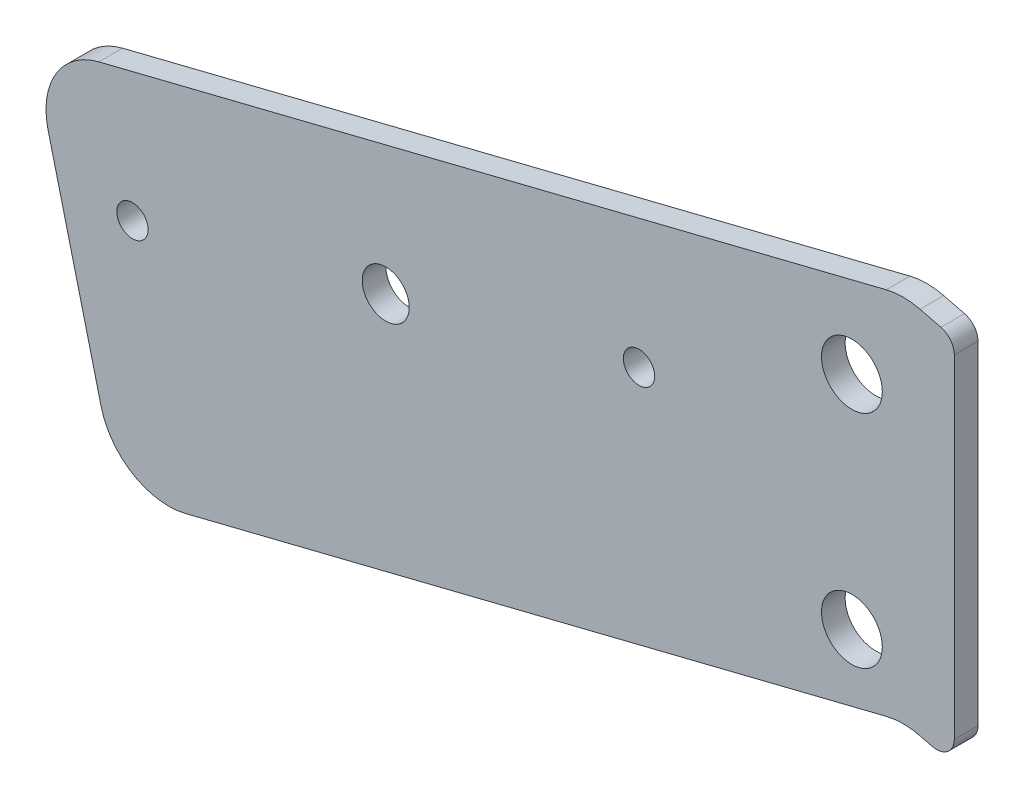
ISO-10303-21;
HEADER;
FILE_DESCRIPTION(('STEP AP214'),'2;1');
FILE_NAME('part.step','',(''),(''),'','','');
FILE_SCHEMA(('AUTOMOTIVE_DESIGN { 1 0 10303 214 1 1 1 1 }'));
ENDSEC;
DATA;
#1=APPLICATION_CONTEXT('core data for automotive mechanical design processes');
#2=APPLICATION_PROTOCOL_DEFINITION('international standard','automotive_design',2000,#1);
#3=PRODUCT_CONTEXT('',#1,'mechanical');
#4=PRODUCT('Part','Part','',(#3));
#5=PRODUCT_RELATED_PRODUCT_CATEGORY('part','',(#4));
#6=PRODUCT_DEFINITION_FORMATION('','',#4);
#7=PRODUCT_DEFINITION_CONTEXT('part definition',#1,'design');
#8=PRODUCT_DEFINITION('design','',#6,#7);
#9=PRODUCT_DEFINITION_SHAPE('','',#8);
#10=(LENGTH_UNIT() NAMED_UNIT(*) SI_UNIT(.MILLI.,.METRE.));
#11=(NAMED_UNIT(*) PLANE_ANGLE_UNIT() SI_UNIT($,.RADIAN.));
#12=(NAMED_UNIT(*) SI_UNIT($,.STERADIAN.) SOLID_ANGLE_UNIT());
#13=UNCERTAINTY_MEASURE_WITH_UNIT(LENGTH_MEASURE(1.E-05),#10,'distance_accuracy_value','');
#14=(GEOMETRIC_REPRESENTATION_CONTEXT(3) GLOBAL_UNCERTAINTY_ASSIGNED_CONTEXT((#13)) GLOBAL_UNIT_ASSIGNED_CONTEXT((#10,
#11,#12)) REPRESENTATION_CONTEXT('',''));
#15=CARTESIAN_POINT('',(0.,0.,0.));
#16=DIRECTION('',(0.,0.,1.));
#17=DIRECTION('',(1.,0.,0.));
#18=AXIS2_PLACEMENT_3D('',#15,#16,#17);
#19=CARTESIAN_POINT('',(4.80832124547875,-67.8898570883943,-3.4036));
#20=DIRECTION('',(0.,0.,1.));
#21=DIRECTION('',(1.,0.,0.));
#22=AXIS2_PLACEMENT_3D('',#19,#20,#21);
#23=CYLINDRICAL_SURFACE('',#22,2.54);
#24=CARTESIAN_POINT('',(4.80832124547875,-67.8898570883943,0.));
#25=DIRECTION('',(0.,0.,1.));
#26=DIRECTION('',(1.,0.,0.));
#27=AXIS2_PLACEMENT_3D('',#24,#25,#26);
#28=CIRCLE('',#27,2.54);
#29=CARTESIAN_POINT('',(4.19383963065623,-70.3544082331355,0.));
#30=VERTEX_POINT('',#29);
#31=CARTESIAN_POINT('',(7.34832124547875,-67.8898570883943,0.));
#32=VERTEX_POINT('',#31);
#33=EDGE_CURVE('E159',#30,#32,#28,.T.);
#34=ORIENTED_EDGE('',*,*,#33,.F.);
#35=DIRECTION('',(0.,0.,1.));
#36=VECTOR('',#35,1.);
#37=CARTESIAN_POINT('',(4.19383963065623,-70.3544082331355,-3.4036));
#38=LINE('',#37,#36);
#39=CARTESIAN_POINT('',(4.19383963065623,-70.3544082331355,-3.4036));
#40=VERTEX_POINT('',#39);
#41=EDGE_CURVE('E11',#40,#30,#38,.T.);
#42=ORIENTED_EDGE('',*,*,#41,.F.);
#43=CARTESIAN_POINT('',(4.80832124547875,-67.8898570883943,-3.4036));
#44=DIRECTION('',(0.,0.,1.));
#45=DIRECTION('',(1.,0.,0.));
#46=AXIS2_PLACEMENT_3D('',#43,#44,#45);
#47=CIRCLE('',#46,2.54);
#48=CARTESIAN_POINT('',(7.34832124547875,-67.8898570883943,-3.4036));
#49=VERTEX_POINT('',#48);
#50=EDGE_CURVE('E192',#40,#49,#47,.T.);
#51=ORIENTED_EDGE('',*,*,#50,.T.);
#52=DIRECTION('',(0.,0.,1.));
#53=VECTOR('',#52,1.);
#54=CARTESIAN_POINT('',(7.34832124547875,-67.8898570883943,-3.4036));
#55=LINE('',#54,#53);
#56=EDGE_CURVE('E41',#49,#32,#55,.T.);
#57=ORIENTED_EDGE('',*,*,#56,.T.);
#58=EDGE_LOOP('',(#34,#42,#51,#57));
#59=FACE_BOUND('',#58,.T.);
#60=ADVANCED_FACE('F38',(#59),#23,.T.);
#61=CARTESIAN_POINT('',(4.19383963065623,-70.3544082331355,-3.4036));
#62=DIRECTION('',(-0.241921895599874,-0.970295726275945,0.));
#63=DIRECTION('',(0.970295726275945,-0.241921895599874,0.));
#64=AXIS2_PLACEMENT_3D('',#61,#62,#63);
#65=PLANE('',#64);
#66=DIRECTION('',(0.970295726275945,-0.241921895599874,0.));
#67=VECTOR('',#66,1.);
#68=CARTESIAN_POINT('',(4.19383963065623,-70.3544082331355,0.));
#69=LINE('',#68,#67);
#70=CARTESIAN_POINT('',(2.41921895599391,-69.9119456045174,0.));
#71=VERTEX_POINT('',#70);
#72=EDGE_CURVE('E190',#71,#30,#69,.T.);
#73=ORIENTED_EDGE('',*,*,#72,.F.);
#74=DIRECTION('',(0.,0.,1.));
#75=VECTOR('',#74,1.);
#76=CARTESIAN_POINT('',(2.41921895599391,-69.9119456045174,-3.4036));
#77=LINE('',#76,#75);
#78=CARTESIAN_POINT('',(2.41921895599391,-69.9119456045174,-3.4036));
#79=VERTEX_POINT('',#78);
#80=EDGE_CURVE('E47',#79,#71,#77,.T.);
#81=ORIENTED_EDGE('',*,*,#80,.F.);
#82=DIRECTION('',(0.970295726275945,-0.241921895599874,0.));
#83=VECTOR('',#82,1.);
#84=CARTESIAN_POINT('',(4.19383963065623,-70.3544082331355,-3.4036));
#85=LINE('',#84,#83);
#86=EDGE_CURVE('E149',#79,#40,#85,.T.);
#87=ORIENTED_EDGE('',*,*,#86,.T.);
#88=ORIENTED_EDGE('',*,*,#41,.T.);
#89=EDGE_LOOP('',(#73,#81,#87,#88));
#90=FACE_BOUND('',#89,.T.);
#91=ADVANCED_FACE('F212',(#90),#65,.T.);
#92=CARTESIAN_POINT('',(3.00020425170189E-12,-79.6149028672788,-3.4036));
#93=DIRECTION('',(0.,0.,1.));
#94=DIRECTION('',(1.,0.,0.));
#95=AXIS2_PLACEMENT_3D('',#92,#93,#94);
#96=CYLINDRICAL_SURFACE('',#95,10.);
#97=CARTESIAN_POINT('',(3.00020425170189E-12,-79.6149028672788,0.));
#98=DIRECTION('',(0.,0.,-1.));
#99=DIRECTION('',(1.,0.,0.));
#100=AXIS2_PLACEMENT_3D('',#97,#98,#99);
#101=CIRCLE('',#100,10.);
#102=CARTESIAN_POINT('',(-2.41921895599365,-69.9119456045188,0.));
#103=VERTEX_POINT('',#102);
#104=EDGE_CURVE('E136',#103,#71,#101,.T.);
#105=ORIENTED_EDGE('',*,*,#104,.F.);
#106=DIRECTION('',(0.,0.,1.));
#107=VECTOR('',#106,1.);
#108=CARTESIAN_POINT('',(-2.41921895599365,-69.9119456045188,-3.4036));
#109=LINE('',#108,#107);
#110=CARTESIAN_POINT('',(-2.41921895599365,-69.9119456045188,-3.4036));
#111=VERTEX_POINT('',#110);
#112=EDGE_CURVE('E131',#111,#103,#109,.T.);
#113=ORIENTED_EDGE('',*,*,#112,.F.);
#114=CARTESIAN_POINT('',(3.00020425170189E-12,-79.6149028672788,-3.4036));
#115=DIRECTION('',(0.,0.,-1.));
#116=DIRECTION('',(1.,0.,0.));
#117=AXIS2_PLACEMENT_3D('',#114,#115,#116);
#118=CIRCLE('',#117,10.);
#119=EDGE_CURVE('E134',#111,#79,#118,.T.);
#120=ORIENTED_EDGE('',*,*,#119,.T.);
#121=ORIENTED_EDGE('',*,*,#80,.T.);
#122=EDGE_LOOP('',(#105,#113,#120,#121));
#123=FACE_BOUND('',#122,.T.);
#124=ADVANCED_FACE('F133',(#123),#96,.F.);
#125=CARTESIAN_POINT('',(-2.41921895599365,-69.9119456045188,-3.4036));
#126=DIRECTION('',(0.241921895599666,-0.970295726275997,0.));
#127=DIRECTION('',(0.970295726275997,0.241921895599666,0.));
#128=AXIS2_PLACEMENT_3D('',#125,#126,#127);
#129=PLANE('',#128);
#130=DIRECTION('',(0.970295726275997,0.241921895599666,0.));
#131=VECTOR('',#130,1.);
#132=CARTESIAN_POINT('',(-2.41921895599365,-69.9119456045188,0.));
#133=LINE('',#132,#131);
#134=CARTESIAN_POINT('',(-103.10199011941,-95.0149798594103,0.));
#135=VERTEX_POINT('',#134);
#136=EDGE_CURVE('E187',#135,#103,#133,.T.);
#137=ORIENTED_EDGE('',*,*,#136,.F.);
#138=DIRECTION('',(0.,0.,1.));
#139=VECTOR('',#138,1.);
#140=CARTESIAN_POINT('',(-103.10199011941,-95.0149798594103,-3.4036));
#141=LINE('',#140,#139);
#142=CARTESIAN_POINT('',(-103.10199011941,-95.0149798594103,-3.4036));
#143=VERTEX_POINT('',#142);
#144=EDGE_CURVE('E141',#143,#135,#141,.T.);
#145=ORIENTED_EDGE('',*,*,#144,.F.);
#146=DIRECTION('',(0.970295726275997,0.241921895599666,0.));
#147=VECTOR('',#146,1.);
#148=CARTESIAN_POINT('',(-2.41921895599365,-69.9119456045188,-3.4036));
#149=LINE('',#148,#147);
#150=EDGE_CURVE('E147',#143,#111,#149,.T.);
#151=ORIENTED_EDGE('',*,*,#150,.T.);
#152=ORIENTED_EDGE('',*,*,#112,.T.);
#153=EDGE_LOOP('',(#137,#145,#151,#152));
#154=FACE_BOUND('',#153,.T.);
#155=ADVANCED_FACE('F151',(#154),#129,.T.);
#156=CARTESIAN_POINT('',(-105.521209075407,-85.3120225966503,-3.4036));
#157=DIRECTION('',(0.,0.,1.));
#158=DIRECTION('',(1.,0.,0.));
#159=AXIS2_PLACEMENT_3D('',#156,#157,#158);
#160=CYLINDRICAL_SURFACE('',#159,9.99999999999999);
#161=CARTESIAN_POINT('',(-105.521209075407,-85.3120225966503,0.));
#162=DIRECTION('',(0.,0.,1.));
#163=DIRECTION('',(-1.,0.,0.));
#164=AXIS2_PLACEMENT_3D('',#161,#162,#163);
#165=CIRCLE('',#164,9.99999999999999);
#166=CARTESIAN_POINT('',(-115.224166338167,-87.7312415526469,0.));
#167=VERTEX_POINT('',#166);
#168=EDGE_CURVE('E184',#167,#135,#165,.T.);
#169=ORIENTED_EDGE('',*,*,#168,.F.);
#170=DIRECTION('',(0.,0.,1.));
#171=VECTOR('',#170,1.);
#172=CARTESIAN_POINT('',(-115.224166338167,-87.7312415526469,-3.4036));
#173=LINE('',#172,#171);
#174=CARTESIAN_POINT('',(-115.224166338167,-87.7312415526469,-3.4036));
#175=VERTEX_POINT('',#174);
#176=EDGE_CURVE('E196',#175,#167,#173,.T.);
#177=ORIENTED_EDGE('',*,*,#176,.F.);
#178=CARTESIAN_POINT('',(-105.521209075407,-85.3120225966503,-3.4036));
#179=DIRECTION('',(0.,0.,1.));
#180=DIRECTION('',(-1.,0.,0.));
#181=AXIS2_PLACEMENT_3D('',#178,#179,#180);
#182=CIRCLE('',#181,9.99999999999999);
#183=EDGE_CURVE('E152',#175,#143,#182,.T.);
#184=ORIENTED_EDGE('',*,*,#183,.T.);
#185=ORIENTED_EDGE('',*,*,#144,.T.);
#186=EDGE_LOOP('',(#169,#177,#184,#185));
#187=FACE_BOUND('',#186,.T.);
#188=ADVANCED_FACE('F225',(#187),#160,.T.);
#189=CARTESIAN_POINT('',(-115.224166338167,-87.7312415526469,-3.4036));
#190=DIRECTION('',(-0.970295726275997,-0.241921895599665,0.));
#191=DIRECTION('',(0.241921895599665,-0.970295726275997,0.));
#192=AXIS2_PLACEMENT_3D('',#189,#190,#191);
#193=PLANE('',#192);
#194=DIRECTION('',(0.241921895599665,-0.970295726275997,0.));
#195=VECTOR('',#194,1.);
#196=CARTESIAN_POINT('',(-115.224166338167,-87.7312415526469,0.));
#197=LINE('',#196,#195);
#198=CARTESIAN_POINT('',(-122.844706049556,-57.166926174953,0.));
#199=VERTEX_POINT('',#198);
#200=EDGE_CURVE('E181',#199,#167,#197,.T.);
#201=ORIENTED_EDGE('',*,*,#200,.F.);
#202=DIRECTION('',(0.,0.,1.));
#203=VECTOR('',#202,1.);
#204=CARTESIAN_POINT('',(-122.844706049556,-57.166926174953,-3.4036));
#205=LINE('',#204,#203);
#206=CARTESIAN_POINT('',(-122.844706049556,-57.166926174953,-3.4036));
#207=VERTEX_POINT('',#206);
#208=EDGE_CURVE('E198',#207,#199,#205,.T.);
#209=ORIENTED_EDGE('',*,*,#208,.F.);
#210=DIRECTION('',(0.241921895599665,-0.970295726275997,0.));
#211=VECTOR('',#210,1.);
#212=CARTESIAN_POINT('',(-115.224166338167,-87.7312415526469,-3.4036));
#213=LINE('',#212,#211);
#214=EDGE_CURVE('E154',#207,#175,#213,.T.);
#215=ORIENTED_EDGE('',*,*,#214,.T.);
#216=ORIENTED_EDGE('',*,*,#176,.T.);
#217=EDGE_LOOP('',(#201,#209,#215,#216));
#218=FACE_BOUND('',#217,.T.);
#219=ADVANCED_FACE('F228',(#218),#193,.T.);
#220=CARTESIAN_POINT('',(-113.141748786797,-54.7477072189564,-3.4036));
#221=DIRECTION('',(0.,0.,1.));
#222=DIRECTION('',(1.,0.,0.));
#223=AXIS2_PLACEMENT_3D('',#220,#221,#222);
#224=CYLINDRICAL_SURFACE('',#223,10.);
#225=CARTESIAN_POINT('',(-113.141748786797,-54.7477072189564,0.));
#226=DIRECTION('',(0.,0.,1.));
#227=DIRECTION('',(1.,0.,0.));
#228=AXIS2_PLACEMENT_3D('',#225,#226,#227);
#229=CIRCLE('',#228,10.);
#230=CARTESIAN_POINT('',(-115.560967742793,-45.0447499561964,0.));
#231=VERTEX_POINT('',#230);
#232=EDGE_CURVE('E178',#231,#199,#229,.T.);
#233=ORIENTED_EDGE('',*,*,#232,.F.);
#234=DIRECTION('',(0.,0.,1.));
#235=VECTOR('',#234,1.);
#236=CARTESIAN_POINT('',(-115.560967742793,-45.0447499561964,-3.4036));
#237=LINE('',#236,#235);
#238=CARTESIAN_POINT('',(-115.560967742793,-45.0447499561964,-3.4036));
#239=VERTEX_POINT('',#238);
#240=EDGE_CURVE('E200',#239,#231,#237,.T.);
#241=ORIENTED_EDGE('',*,*,#240,.F.);
#242=CARTESIAN_POINT('',(-113.141748786797,-54.7477072189564,-3.4036));
#243=DIRECTION('',(0.,0.,1.));
#244=DIRECTION('',(1.,0.,0.));
#245=AXIS2_PLACEMENT_3D('',#242,#243,#244);
#246=CIRCLE('',#245,10.);
#247=EDGE_CURVE('E332',#239,#207,#246,.T.);
#248=ORIENTED_EDGE('',*,*,#247,.T.);
#249=ORIENTED_EDGE('',*,*,#208,.T.);
#250=EDGE_LOOP('',(#233,#241,#248,#249));
#251=FACE_BOUND('',#250,.T.);
#252=ADVANCED_FACE('F232',(#251),#224,.T.);
#253=CARTESIAN_POINT('',(-115.560967742793,-45.0447499561964,-3.4036));
#254=DIRECTION('',(-0.241921895599665,0.970295726275997,0.));
#255=DIRECTION('',(-0.970295726275997,-0.241921895599665,0.));
#256=AXIS2_PLACEMENT_3D('',#253,#254,#255);
#257=PLANE('',#256);
#258=DIRECTION('',(-0.970295726275997,-0.241921895599665,0.));
#259=VECTOR('',#258,1.);
#260=CARTESIAN_POINT('',(-115.560967742793,-45.0447499561964,0.));
#261=LINE('',#260,#259);
#262=CARTESIAN_POINT('',(-2.41921895599665,-16.8353436929998,0.));
#263=VERTEX_POINT('',#262);
#264=EDGE_CURVE('E175',#263,#231,#261,.T.);
#265=ORIENTED_EDGE('',*,*,#264,.F.);
#266=DIRECTION('',(0.,0.,1.));
#267=VECTOR('',#266,1.);
#268=CARTESIAN_POINT('',(-2.41921895599665,-16.8353436929998,-3.4036));
#269=LINE('',#268,#267);
#270=CARTESIAN_POINT('',(-2.41921895599665,-16.8353436929998,-3.4036));
#271=VERTEX_POINT('',#270);
#272=EDGE_CURVE('E202',#271,#263,#269,.T.);
#273=ORIENTED_EDGE('',*,*,#272,.F.);
#274=DIRECTION('',(-0.970295726275997,-0.241921895599665,0.));
#275=VECTOR('',#274,1.);
#276=CARTESIAN_POINT('',(-115.560967742793,-45.0447499561964,-3.4036));
#277=LINE('',#276,#275);
#278=EDGE_CURVE('E329',#271,#239,#277,.T.);
#279=ORIENTED_EDGE('',*,*,#278,.T.);
#280=ORIENTED_EDGE('',*,*,#240,.T.);
#281=EDGE_LOOP('',(#265,#273,#279,#280));
#282=FACE_BOUND('',#281,.T.);
#283=ADVANCED_FACE('F236',(#282),#257,.T.);
#284=CARTESIAN_POINT('',(0.,-26.5383009557598,-3.4036));
#285=DIRECTION('',(0.,0.,1.));
#286=DIRECTION('',(1.,0.,0.));
#287=AXIS2_PLACEMENT_3D('',#284,#285,#286);
#288=CYLINDRICAL_SURFACE('',#287,10.);
#289=CARTESIAN_POINT('',(0.,-26.5383009557598,0.));
#290=DIRECTION('',(0.,0.,1.));
#291=DIRECTION('',(-1.,0.,0.));
#292=AXIS2_PLACEMENT_3D('',#289,#290,#291);
#293=CIRCLE('',#292,10.);
#294=CARTESIAN_POINT('',(2.41921895599665,-16.8353436929998,0.));
#295=VERTEX_POINT('',#294);
#296=EDGE_CURVE('E172',#295,#263,#293,.T.);
#297=ORIENTED_EDGE('',*,*,#296,.F.);
#298=DIRECTION('',(0.,0.,1.));
#299=VECTOR('',#298,1.);
#300=CARTESIAN_POINT('',(2.41921895599665,-16.8353436929998,-3.4036));
#301=LINE('',#300,#299);
#302=CARTESIAN_POINT('',(2.41921895599665,-16.8353436929998,-3.4036));
#303=VERTEX_POINT('',#302);
#304=EDGE_CURVE('E204',#303,#295,#301,.T.);
#305=ORIENTED_EDGE('',*,*,#304,.F.);
#306=CARTESIAN_POINT('',(0.,-26.5383009557598,-3.4036));
#307=DIRECTION('',(0.,0.,1.));
#308=DIRECTION('',(-1.,0.,0.));
#309=AXIS2_PLACEMENT_3D('',#306,#307,#308);
#310=CIRCLE('',#309,10.);
#311=EDGE_CURVE('E326',#303,#271,#310,.T.);
#312=ORIENTED_EDGE('',*,*,#311,.T.);
#313=ORIENTED_EDGE('',*,*,#272,.T.);
#314=EDGE_LOOP('',(#297,#305,#312,#313));
#315=FACE_BOUND('',#314,.T.);
#316=ADVANCED_FACE('F240',(#315),#288,.T.);
#317=CARTESIAN_POINT('',(2.41921895599665,-16.8353436929998,-3.4036));
#318=DIRECTION('',(0.241921895599675,0.970295726275995,0.));
#319=DIRECTION('',(-0.970295726275995,0.241921895599675,0.));
#320=AXIS2_PLACEMENT_3D('',#317,#318,#319);
#321=PLANE('',#320);
#322=DIRECTION('',(-0.970295726275995,0.241921895599675,0.));
#323=VECTOR('',#322,1.);
#324=CARTESIAN_POINT('',(2.41921895599665,-16.8353436929998,0.));
#325=LINE('',#324,#323);
#326=CARTESIAN_POINT('',(5.42280286030191,-17.5842212692322,0.));
#327=VERTEX_POINT('',#326);
#328=EDGE_CURVE('E169',#327,#295,#325,.T.);
#329=ORIENTED_EDGE('',*,*,#328,.F.);
#330=DIRECTION('',(0.,0.,1.));
#331=VECTOR('',#330,1.);
#332=CARTESIAN_POINT('',(5.42280286030191,-17.5842212692322,-3.4036));
#333=LINE('',#332,#331);
#334=CARTESIAN_POINT('',(5.42280286030191,-17.5842212692322,-3.4036));
#335=VERTEX_POINT('',#334);
#336=EDGE_CURVE('E206',#335,#327,#333,.T.);
#337=ORIENTED_EDGE('',*,*,#336,.F.);
#338=DIRECTION('',(-0.970295726275995,0.241921895599675,0.));
#339=VECTOR('',#338,1.);
#340=CARTESIAN_POINT('',(2.41921895599665,-16.8353436929998,-3.4036));
#341=LINE('',#340,#339);
#342=EDGE_CURVE('E323',#335,#303,#341,.T.);
#343=ORIENTED_EDGE('',*,*,#342,.T.);
#344=ORIENTED_EDGE('',*,*,#304,.T.);
#345=EDGE_LOOP('',(#329,#337,#343,#344));
#346=FACE_BOUND('',#345,.T.);
#347=ADVANCED_FACE('F244',(#346),#321,.T.);
#348=CARTESIAN_POINT('',(4.80832124547874,-20.0487724139733,-3.4036));
#349=DIRECTION('',(0.,0.,1.));
#350=DIRECTION('',(1.,0.,0.));
#351=AXIS2_PLACEMENT_3D('',#348,#349,#350);
#352=CYLINDRICAL_SURFACE('',#351,2.54);
#353=CARTESIAN_POINT('',(4.80832124547874,-20.0487724139733,0.));
#354=DIRECTION('',(0.,0.,1.));
#355=DIRECTION('',(-1.,0.,0.));
#356=AXIS2_PLACEMENT_3D('',#353,#354,#355);
#357=CIRCLE('',#356,2.54);
#358=CARTESIAN_POINT('',(7.34832124547874,-20.0487724139733,0.));
#359=VERTEX_POINT('',#358);
#360=EDGE_CURVE('E166',#359,#327,#357,.T.);
#361=ORIENTED_EDGE('',*,*,#360,.F.);
#362=DIRECTION('',(0.,0.,1.));
#363=VECTOR('',#362,1.);
#364=CARTESIAN_POINT('',(7.34832124547874,-20.0487724139733,-3.4036));
#365=LINE('',#364,#363);
#366=CARTESIAN_POINT('',(7.34832124547874,-20.0487724139733,-3.4036));
#367=VERTEX_POINT('',#366);
#368=EDGE_CURVE('E207',#367,#359,#365,.T.);
#369=ORIENTED_EDGE('',*,*,#368,.F.);
#370=CARTESIAN_POINT('',(4.80832124547874,-20.0487724139733,-3.4036));
#371=DIRECTION('',(0.,0.,1.));
#372=DIRECTION('',(-1.,0.,0.));
#373=AXIS2_PLACEMENT_3D('',#370,#371,#372);
#374=CIRCLE('',#373,2.54);
#375=EDGE_CURVE('E320',#367,#335,#374,.T.);
#376=ORIENTED_EDGE('',*,*,#375,.T.);
#377=ORIENTED_EDGE('',*,*,#336,.T.);
#378=EDGE_LOOP('',(#361,#369,#376,#377));
#379=FACE_BOUND('',#378,.T.);
#380=ADVANCED_FACE('F248',(#379),#352,.T.);
#381=CARTESIAN_POINT('',(7.34832124547874,-20.0487724139733,-3.4036));
#382=DIRECTION('',(1.,0.,0.));
#383=DIRECTION('',(0.,1.,0.));
#384=AXIS2_PLACEMENT_3D('',#381,#382,#383);
#385=PLANE('',#384);
#386=DIRECTION('',(0.,1.,0.));
#387=VECTOR('',#386,1.);
#388=CARTESIAN_POINT('',(7.34832124547874,-20.0487724139733,0.));
#389=LINE('',#388,#387);
#390=EDGE_CURVE('E162',#32,#359,#389,.T.);
#391=ORIENTED_EDGE('',*,*,#390,.F.);
#392=ORIENTED_EDGE('',*,*,#56,.F.);
#393=DIRECTION('',(0.,1.,0.));
#394=VECTOR('',#393,1.);
#395=CARTESIAN_POINT('',(7.34832124547874,-20.0487724139733,-3.4036));
#396=LINE('',#395,#394);
#397=EDGE_CURVE('E318',#49,#367,#396,.T.);
#398=ORIENTED_EDGE('',*,*,#397,.T.);
#399=ORIENTED_EDGE('',*,*,#368,.T.);
#400=EDGE_LOOP('',(#391,#392,#398,#399));
#401=FACE_BOUND('',#400,.T.);
#402=ADVANCED_FACE('F209',(#401),#385,.T.);
#403=CARTESIAN_POINT('',(4.80832124547875,-67.8898570883943,-3.4036));
#404=DIRECTION('',(0.,0.,1.));
#405=DIRECTION('',(1.,0.,0.));
#406=AXIS2_PLACEMENT_3D('',#403,#404,#405);
#407=PLANE('',#406);
#408=CARTESIAN_POINT('',(-7.36599999999999,-61.5695602345621,-3.4036));
#409=DIRECTION('',(0.,0.,1.));
#410=DIRECTION('',(1.,0.,0.));
#411=AXIS2_PLACEMENT_3D('',#408,#409,#410);
#412=CIRCLE('',#411,4.3688);
#413=CARTESIAN_POINT('',(-2.99719999999999,-61.5695602345621,-3.4036));
#414=VERTEX_POINT('',#413);
#415=EDGE_CURVE('E287',#414,#414,#412,.T.);
#416=ORIENTED_EDGE('',*,*,#415,.T.);
#417=EDGE_LOOP('',(#416));
#418=FACE_BOUND('',#417,.T.);
#419=CARTESIAN_POINT('',(-7.366,-29.8195602345622,-3.4036));
#420=DIRECTION('',(0.,0.,1.));
#421=DIRECTION('',(1.,0.,0.));
#422=AXIS2_PLACEMENT_3D('',#419,#420,#421);
#423=CIRCLE('',#422,4.3688);
#424=CARTESIAN_POINT('',(-2.9972,-29.8195602345622,-3.4036));
#425=VERTEX_POINT('',#424);
#426=EDGE_CURVE('E297',#425,#425,#423,.T.);
#427=ORIENTED_EDGE('',*,*,#426,.T.);
#428=EDGE_LOOP('',(#427));
#429=FACE_BOUND('',#428,.T.);
#430=CARTESIAN_POINT('',(-110.721225758861,-62.3891120813645,-3.4036));
#431=DIRECTION('',(0.,0.,1.));
#432=DIRECTION('',(1.,0.,0.));
#433=AXIS2_PLACEMENT_3D('',#430,#431,#432);
#434=CIRCLE('',#433,2.25);
#435=CARTESIAN_POINT('',(-108.471225758861,-62.3891120813645,-3.4036));
#436=VERTEX_POINT('',#435);
#437=EDGE_CURVE('E303',#436,#436,#434,.T.);
#438=ORIENTED_EDGE('',*,*,#437,.T.);
#439=EDGE_LOOP('',(#438));
#440=FACE_BOUND('',#439,.T.);
#441=CARTESIAN_POINT('',(-37.9490462881614,-44.2449699113896,-3.4036));
#442=DIRECTION('',(0.,0.,1.));
#443=DIRECTION('',(1.,0.,0.));
#444=AXIS2_PLACEMENT_3D('',#441,#442,#443);
#445=CIRCLE('',#444,2.25);
#446=CARTESIAN_POINT('',(-35.6990462881614,-44.2449699113896,-3.4036));
#447=VERTEX_POINT('',#446);
#448=EDGE_CURVE('E309',#447,#447,#445,.T.);
#449=ORIENTED_EDGE('',*,*,#448,.T.);
#450=EDGE_LOOP('',(#449));
#451=FACE_BOUND('',#450,.T.);
#452=CARTESIAN_POINT('',(-74.3351360235113,-53.317040996377,-3.4036));
#453=DIRECTION('',(0.,0.,1.));
#454=DIRECTION('',(1.,0.,0.));
#455=AXIS2_PLACEMENT_3D('',#452,#453,#454);
#456=CIRCLE('',#455,3.3782);
#457=CARTESIAN_POINT('',(-70.9569360235113,-53.317040996377,-3.4036));
#458=VERTEX_POINT('',#457);
#459=EDGE_CURVE('E163',#458,#458,#456,.T.);
#460=ORIENTED_EDGE('',*,*,#459,.T.);
#461=EDGE_LOOP('',(#460));
#462=FACE_BOUND('',#461,.T.);
#463=ORIENTED_EDGE('',*,*,#50,.F.);
#464=ORIENTED_EDGE('',*,*,#86,.F.);
#465=ORIENTED_EDGE('',*,*,#119,.F.);
#466=ORIENTED_EDGE('',*,*,#150,.F.);
#467=ORIENTED_EDGE('',*,*,#183,.F.);
#468=ORIENTED_EDGE('',*,*,#214,.F.);
#469=ORIENTED_EDGE('',*,*,#247,.F.);
#470=ORIENTED_EDGE('',*,*,#278,.F.);
#471=ORIENTED_EDGE('',*,*,#311,.F.);
#472=ORIENTED_EDGE('',*,*,#342,.F.);
#473=ORIENTED_EDGE('',*,*,#375,.F.);
#474=ORIENTED_EDGE('',*,*,#397,.F.);
#475=EDGE_LOOP('',(#463,#464,#465,#466,#467,#468,#469,#470,#471,#472,#473,#474));
#476=FACE_BOUND('',#475,.T.);
#477=ADVANCED_FACE('F145',(#418,#429,#440,#451,#462,#476),#407,.F.);
#478=CARTESIAN_POINT('',(4.80832124547875,-67.8898570883943,0.));
#479=DIRECTION('',(0.,0.,1.));
#480=DIRECTION('',(1.,0.,0.));
#481=AXIS2_PLACEMENT_3D('',#478,#479,#480);
#482=PLANE('',#481);
#483=CARTESIAN_POINT('',(-7.36599999999999,-61.5695602345621,0.));
#484=DIRECTION('',(0.,0.,1.));
#485=DIRECTION('',(1.,0.,0.));
#486=AXIS2_PLACEMENT_3D('',#483,#484,#485);
#487=CIRCLE('',#486,4.3688);
#488=CARTESIAN_POINT('',(-2.99719999999999,-61.5695602345621,0.));
#489=VERTEX_POINT('',#488);
#490=EDGE_CURVE('E290',#489,#489,#487,.T.);
#491=ORIENTED_EDGE('',*,*,#490,.F.);
#492=EDGE_LOOP('',(#491));
#493=FACE_BOUND('',#492,.T.);
#494=CARTESIAN_POINT('',(-7.366,-29.8195602345622,0.));
#495=DIRECTION('',(0.,0.,1.));
#496=DIRECTION('',(1.,0.,0.));
#497=AXIS2_PLACEMENT_3D('',#494,#495,#496);
#498=CIRCLE('',#497,4.3688);
#499=CARTESIAN_POINT('',(-2.9972,-29.8195602345622,0.));
#500=VERTEX_POINT('',#499);
#501=EDGE_CURVE('E292',#500,#500,#498,.T.);
#502=ORIENTED_EDGE('',*,*,#501,.F.);
#503=EDGE_LOOP('',(#502));
#504=FACE_BOUND('',#503,.T.);
#505=CARTESIAN_POINT('',(-110.721225758861,-62.3891120813645,0.));
#506=DIRECTION('',(0.,0.,1.));
#507=DIRECTION('',(1.,0.,0.));
#508=AXIS2_PLACEMENT_3D('',#505,#506,#507);
#509=CIRCLE('',#508,2.25);
#510=CARTESIAN_POINT('',(-108.471225758861,-62.3891120813645,0.));
#511=VERTEX_POINT('',#510);
#512=EDGE_CURVE('E300',#511,#511,#509,.T.);
#513=ORIENTED_EDGE('',*,*,#512,.F.);
#514=EDGE_LOOP('',(#513));
#515=FACE_BOUND('',#514,.T.);
#516=CARTESIAN_POINT('',(-37.9490462881614,-44.2449699113896,0.));
#517=DIRECTION('',(0.,0.,1.));
#518=DIRECTION('',(1.,0.,0.));
#519=AXIS2_PLACEMENT_3D('',#516,#517,#518);
#520=CIRCLE('',#519,2.25);
#521=CARTESIAN_POINT('',(-35.6990462881614,-44.2449699113896,0.));
#522=VERTEX_POINT('',#521);
#523=EDGE_CURVE('E306',#522,#522,#520,.T.);
#524=ORIENTED_EDGE('',*,*,#523,.F.);
#525=EDGE_LOOP('',(#524));
#526=FACE_BOUND('',#525,.T.);
#527=CARTESIAN_POINT('',(-74.3351360235113,-53.317040996377,0.));
#528=DIRECTION('',(0.,0.,1.));
#529=DIRECTION('',(1.,0.,0.));
#530=AXIS2_PLACEMENT_3D('',#527,#528,#529);
#531=CIRCLE('',#530,3.3782);
#532=CARTESIAN_POINT('',(-70.9569360235113,-53.317040996377,0.));
#533=VERTEX_POINT('',#532);
#534=EDGE_CURVE('E312',#533,#533,#531,.T.);
#535=ORIENTED_EDGE('',*,*,#534,.F.);
#536=EDGE_LOOP('',(#535));
#537=FACE_BOUND('',#536,.T.);
#538=ORIENTED_EDGE('',*,*,#33,.T.);
#539=ORIENTED_EDGE('',*,*,#390,.T.);
#540=ORIENTED_EDGE('',*,*,#360,.T.);
#541=ORIENTED_EDGE('',*,*,#328,.T.);
#542=ORIENTED_EDGE('',*,*,#296,.T.);
#543=ORIENTED_EDGE('',*,*,#264,.T.);
#544=ORIENTED_EDGE('',*,*,#232,.T.);
#545=ORIENTED_EDGE('',*,*,#200,.T.);
#546=ORIENTED_EDGE('',*,*,#168,.T.);
#547=ORIENTED_EDGE('',*,*,#136,.T.);
#548=ORIENTED_EDGE('',*,*,#104,.T.);
#549=ORIENTED_EDGE('',*,*,#72,.T.);
#550=EDGE_LOOP('',(#538,#539,#540,#541,#542,#543,#544,#545,#546,#547,#548,#549));
#551=FACE_BOUND('',#550,.T.);
#552=ADVANCED_FACE('F211',(#493,#504,#515,#526,#537,#551),#482,.T.);
#553=CARTESIAN_POINT('',(-74.3351360235113,-53.317040996377,0.));
#554=DIRECTION('',(0.,0.,1.));
#555=DIRECTION('',(1.,0.,0.));
#556=AXIS2_PLACEMENT_3D('',#553,#554,#555);
#557=CYLINDRICAL_SURFACE('',#556,3.3782);
#558=ORIENTED_EDGE('',*,*,#459,.F.);
#559=EDGE_LOOP('',(#558));
#560=FACE_BOUND('',#559,.T.);
#561=ORIENTED_EDGE('',*,*,#534,.T.);
#562=EDGE_LOOP('',(#561));
#563=FACE_BOUND('',#562,.T.);
#564=ADVANCED_FACE('F260',(#560,#563),#557,.F.);
#565=CARTESIAN_POINT('',(-37.9490462881614,-44.2449699113896,0.));
#566=DIRECTION('',(0.,0.,1.));
#567=DIRECTION('',(1.,0.,0.));
#568=AXIS2_PLACEMENT_3D('',#565,#566,#567);
#569=CYLINDRICAL_SURFACE('',#568,2.25);
#570=ORIENTED_EDGE('',*,*,#448,.F.);
#571=EDGE_LOOP('',(#570));
#572=FACE_BOUND('',#571,.T.);
#573=ORIENTED_EDGE('',*,*,#523,.T.);
#574=EDGE_LOOP('',(#573));
#575=FACE_BOUND('',#574,.T.);
#576=ADVANCED_FACE('F267',(#572,#575),#569,.F.);
#577=CARTESIAN_POINT('',(-110.721225758861,-62.3891120813645,0.));
#578=DIRECTION('',(0.,0.,1.));
#579=DIRECTION('',(1.,0.,0.));
#580=AXIS2_PLACEMENT_3D('',#577,#578,#579);
#581=CYLINDRICAL_SURFACE('',#580,2.25);
#582=ORIENTED_EDGE('',*,*,#437,.F.);
#583=EDGE_LOOP('',(#582));
#584=FACE_BOUND('',#583,.T.);
#585=ORIENTED_EDGE('',*,*,#512,.T.);
#586=EDGE_LOOP('',(#585));
#587=FACE_BOUND('',#586,.T.);
#588=ADVANCED_FACE('F271',(#584,#587),#581,.F.);
#589=CARTESIAN_POINT('',(-7.366,-29.8195602345622,0.));
#590=DIRECTION('',(0.,0.,1.));
#591=DIRECTION('',(1.,0.,0.));
#592=AXIS2_PLACEMENT_3D('',#589,#590,#591);
#593=CYLINDRICAL_SURFACE('',#592,4.3688);
#594=ORIENTED_EDGE('',*,*,#426,.F.);
#595=EDGE_LOOP('',(#594));
#596=FACE_BOUND('',#595,.T.);
#597=ORIENTED_EDGE('',*,*,#501,.T.);
#598=EDGE_LOOP('',(#597));
#599=FACE_BOUND('',#598,.T.);
#600=ADVANCED_FACE('F275',(#596,#599),#593,.F.);
#601=CARTESIAN_POINT('',(-7.36599999999999,-61.5695602345621,0.));
#602=DIRECTION('',(0.,0.,1.));
#603=DIRECTION('',(1.,0.,0.));
#604=AXIS2_PLACEMENT_3D('',#601,#602,#603);
#605=CYLINDRICAL_SURFACE('',#604,4.3688);
#606=ORIENTED_EDGE('',*,*,#415,.F.);
#607=EDGE_LOOP('',(#606));
#608=FACE_BOUND('',#607,.T.);
#609=ORIENTED_EDGE('',*,*,#490,.T.);
#610=EDGE_LOOP('',(#609));
#611=FACE_BOUND('',#610,.T.);
#612=ADVANCED_FACE('F279',(#608,#611),#605,.F.);
#613=CLOSED_SHELL('',(#60,#91,#124,#155,#188,#219,#252,#283,#316,#347,#380,#402,#477,#552,#564,
#576,#588,#600,#612));
#614=MANIFOLD_SOLID_BREP('B2',#613);
#615=ADVANCED_BREP_SHAPE_REPRESENTATION('',(#18,#614),#14);
#616=SHAPE_DEFINITION_REPRESENTATION(#9,#615);
ENDSEC;
END-ISO-10303-21;
